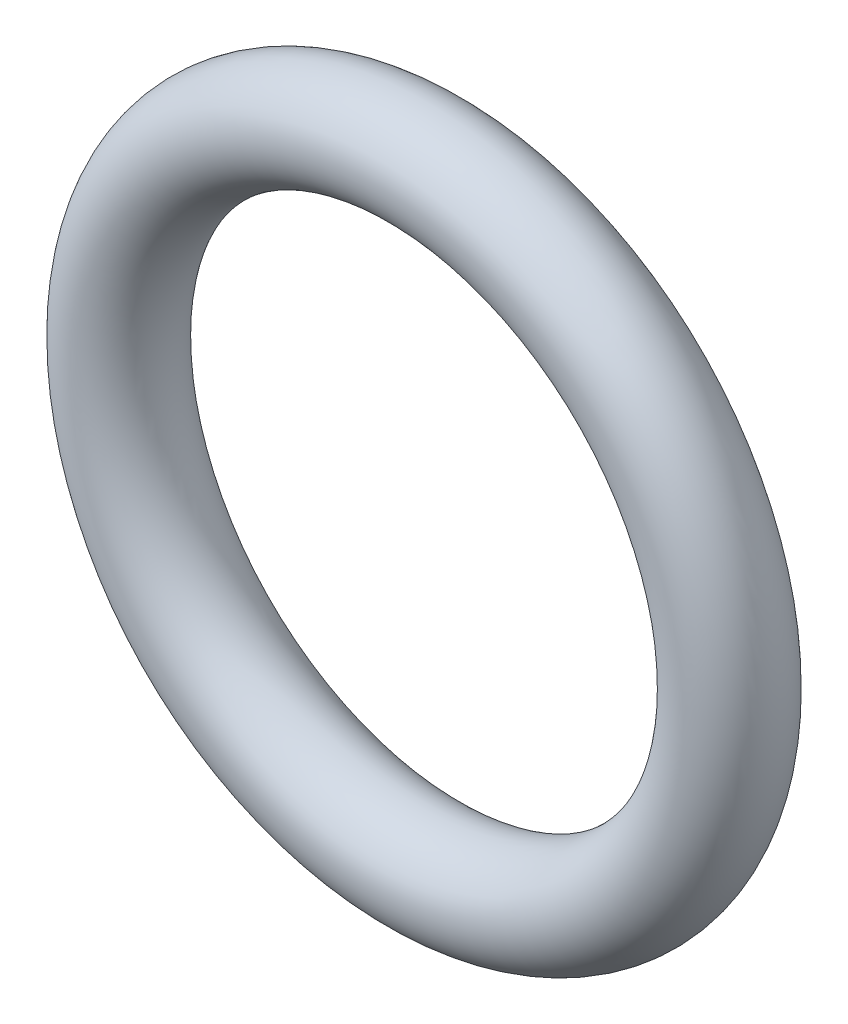
ISO-10303-21;
HEADER;
FILE_DESCRIPTION(('STEP AP214'),'2;1');
FILE_NAME('part.step','',(''),(''),'','','');
FILE_SCHEMA(('AUTOMOTIVE_DESIGN { 1 0 10303 214 1 1 1 1 }'));
ENDSEC;
DATA;
#1=APPLICATION_CONTEXT('core data for automotive mechanical design processes');
#2=APPLICATION_PROTOCOL_DEFINITION('international standard','automotive_design',2000,#1);
#3=PRODUCT_CONTEXT('',#1,'mechanical');
#4=PRODUCT('Part','Part','',(#3));
#5=PRODUCT_RELATED_PRODUCT_CATEGORY('part','',(#4));
#6=PRODUCT_DEFINITION_FORMATION('','',#4);
#7=PRODUCT_DEFINITION_CONTEXT('part definition',#1,'design');
#8=PRODUCT_DEFINITION('design','',#6,#7);
#9=PRODUCT_DEFINITION_SHAPE('','',#8);
#10=(LENGTH_UNIT() NAMED_UNIT(*) SI_UNIT(.MILLI.,.METRE.));
#11=(NAMED_UNIT(*) PLANE_ANGLE_UNIT() SI_UNIT($,.RADIAN.));
#12=(NAMED_UNIT(*) SI_UNIT($,.STERADIAN.) SOLID_ANGLE_UNIT());
#13=UNCERTAINTY_MEASURE_WITH_UNIT(LENGTH_MEASURE(1.E-05),#10,'distance_accuracy_value','');
#14=(GEOMETRIC_REPRESENTATION_CONTEXT(3) GLOBAL_UNCERTAINTY_ASSIGNED_CONTEXT((#13)) GLOBAL_UNIT_ASSIGNED_CONTEXT((#10,
#11,#12)) REPRESENTATION_CONTEXT('',''));
#15=CARTESIAN_POINT('',(0.,0.,0.));
#16=DIRECTION('',(0.,0.,1.));
#17=DIRECTION('',(1.,0.,0.));
#18=AXIS2_PLACEMENT_3D('',#15,#16,#17);
#19=CARTESIAN_POINT('',(152.4,0.,0.));
#20=DIRECTION('',(0.,0.,1.));
#21=DIRECTION('',(1.,0.,0.));
#22=AXIS2_PLACEMENT_3D('',#19,#20,#21);
#23=TOROIDAL_SURFACE('',#22,152.4,25.4);
#24=CARTESIAN_POINT('',(330.2,0.,0.));
#25=VERTEX_POINT('',#24);
#26=VERTEX_LOOP('',#25);
#27=FACE_BOUND('',#26,.T.);
#28=ADVANCED_FACE('F34',(#27),#23,.T.);
#29=CLOSED_SHELL('',(#28));
#30=MANIFOLD_SOLID_BREP('B2',#29);
#31=ADVANCED_BREP_SHAPE_REPRESENTATION('',(#18,#30),#14);
#32=SHAPE_DEFINITION_REPRESENTATION(#9,#31);
ENDSEC;
END-ISO-10303-21;
